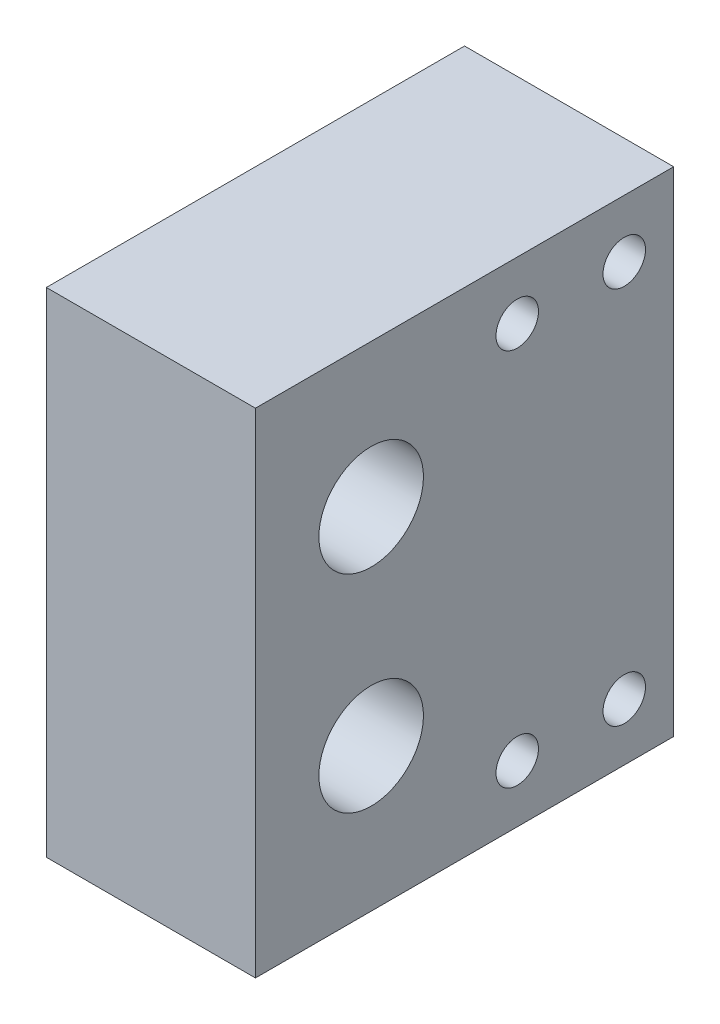
ISO-10303-21;
HEADER;
FILE_DESCRIPTION(('STEP AP214'),'2;1');
FILE_NAME('part.step','',(''),(''),'','','');
FILE_SCHEMA(('AUTOMOTIVE_DESIGN { 1 0 10303 214 1 1 1 1 }'));
ENDSEC;
DATA;
#1=APPLICATION_CONTEXT('core data for automotive mechanical design processes');
#2=APPLICATION_PROTOCOL_DEFINITION('international standard','automotive_design',2000,#1);
#3=PRODUCT_CONTEXT('',#1,'mechanical');
#4=PRODUCT('Part','Part','',(#3));
#5=PRODUCT_RELATED_PRODUCT_CATEGORY('part','',(#4));
#6=PRODUCT_DEFINITION_FORMATION('','',#4);
#7=PRODUCT_DEFINITION_CONTEXT('part definition',#1,'design');
#8=PRODUCT_DEFINITION('design','',#6,#7);
#9=PRODUCT_DEFINITION_SHAPE('','',#8);
#10=(LENGTH_UNIT() NAMED_UNIT(*) SI_UNIT(.MILLI.,.METRE.));
#11=(NAMED_UNIT(*) PLANE_ANGLE_UNIT() SI_UNIT($,.RADIAN.));
#12=(NAMED_UNIT(*) SI_UNIT($,.STERADIAN.) SOLID_ANGLE_UNIT());
#13=UNCERTAINTY_MEASURE_WITH_UNIT(LENGTH_MEASURE(1.E-05),#10,'distance_accuracy_value','');
#14=(GEOMETRIC_REPRESENTATION_CONTEXT(3) GLOBAL_UNCERTAINTY_ASSIGNED_CONTEXT((#13)) GLOBAL_UNIT_ASSIGNED_CONTEXT((#10,
#11,#12)) REPRESENTATION_CONTEXT('',''));
#15=CARTESIAN_POINT('',(0.,0.,0.));
#16=DIRECTION('',(0.,0.,1.));
#17=DIRECTION('',(1.,0.,0.));
#18=AXIS2_PLACEMENT_3D('',#15,#16,#17);
#19=CARTESIAN_POINT('',(-12.701,-12.573,36.7437942065578));
#20=DIRECTION('',(1.,0.,0.));
#21=DIRECTION('',(0.,1.,0.));
#22=AXIS2_PLACEMENT_3D('',#19,#20,#21);
#23=CYLINDRICAL_SURFACE('',#22,3.302);
#24=CARTESIAN_POINT('',(-12.7,-12.573,36.7437942065578));
#25=DIRECTION('',(1.,0.,0.));
#26=DIRECTION('',(0.,1.,0.));
#27=AXIS2_PLACEMENT_3D('',#24,#25,#26);
#28=CIRCLE('',#27,3.302);
#29=CARTESIAN_POINT('',(-12.7,-9.271,36.7437942065578));
#30=VERTEX_POINT('',#29);
#31=EDGE_CURVE('E111',#30,#30,#28,.F.);
#32=ORIENTED_EDGE('',*,*,#31,.T.);
#33=EDGE_LOOP('',(#32));
#34=FACE_BOUND('',#33,.T.);
#35=CARTESIAN_POINT('',(-6.35,-12.573,36.7437942065578));
#36=DIRECTION('',(1.,0.,0.));
#37=DIRECTION('',(0.,1.,0.));
#38=AXIS2_PLACEMENT_3D('',#35,#36,#37);
#39=CIRCLE('',#38,3.302);
#40=CARTESIAN_POINT('',(-6.35,-9.271,36.7437942065578));
#41=VERTEX_POINT('',#40);
#42=EDGE_CURVE('E38',#41,#41,#39,.F.);
#43=ORIENTED_EDGE('',*,*,#42,.F.);
#44=EDGE_LOOP('',(#43));
#45=FACE_BOUND('',#44,.T.);
#46=ADVANCED_FACE('F34',(#34,#45),#23,.F.);
#47=CARTESIAN_POINT('',(-12.701,12.573,36.7437942065578));
#48=DIRECTION('',(1.,0.,0.));
#49=DIRECTION('',(0.,1.,0.));
#50=AXIS2_PLACEMENT_3D('',#47,#48,#49);
#51=CYLINDRICAL_SURFACE('',#50,3.302);
#52=CARTESIAN_POINT('',(-12.7,12.573,36.7437942065578));
#53=DIRECTION('',(1.,0.,0.));
#54=DIRECTION('',(0.,1.,0.));
#55=AXIS2_PLACEMENT_3D('',#52,#53,#54);
#56=CIRCLE('',#55,3.302);
#57=CARTESIAN_POINT('',(-12.7,15.875,36.7437942065578));
#58=VERTEX_POINT('',#57);
#59=EDGE_CURVE('E116',#58,#58,#56,.F.);
#60=ORIENTED_EDGE('',*,*,#59,.T.);
#61=EDGE_LOOP('',(#60));
#62=FACE_BOUND('',#61,.T.);
#63=CARTESIAN_POINT('',(-6.35,12.573,36.7437942065578));
#64=DIRECTION('',(1.,0.,0.));
#65=DIRECTION('',(0.,1.,0.));
#66=AXIS2_PLACEMENT_3D('',#63,#64,#65);
#67=CIRCLE('',#66,3.302);
#68=CARTESIAN_POINT('',(-6.35,15.875,36.7437942065578));
#69=VERTEX_POINT('',#68);
#70=EDGE_CURVE('E109',#69,#69,#67,.F.);
#71=ORIENTED_EDGE('',*,*,#70,.F.);
#72=EDGE_LOOP('',(#71));
#73=FACE_BOUND('',#72,.T.);
#74=ADVANCED_FACE('F159',(#62,#73),#51,.F.);
#75=CARTESIAN_POINT('',(12.7,29.972,50.8));
#76=DIRECTION('',(-1.,0.,0.));
#77=DIRECTION('',(0.,-1.,0.));
#78=AXIS2_PLACEMENT_3D('',#75,#76,#77);
#79=PLANE('',#78);
#80=CARTESIAN_POINT('',(12.7,-12.573,36.7437942065578));
#81=DIRECTION('',(1.,0.,0.));
#82=DIRECTION('',(0.,1.,0.));
#83=AXIS2_PLACEMENT_3D('',#80,#81,#82);
#84=CIRCLE('',#83,6.35);
#85=CARTESIAN_POINT('',(12.7,-6.223,36.7437942065578));
#86=VERTEX_POINT('',#85);
#87=EDGE_CURVE('E126',#86,#86,#84,.T.);
#88=ORIENTED_EDGE('',*,*,#87,.F.);
#89=EDGE_LOOP('',(#88));
#90=FACE_BOUND('',#89,.T.);
#91=CARTESIAN_POINT('',(12.7,12.573,36.7437942065578));
#92=DIRECTION('',(1.,0.,0.));
#93=DIRECTION('',(0.,1.,0.));
#94=AXIS2_PLACEMENT_3D('',#91,#92,#93);
#95=CIRCLE('',#94,6.35);
#96=CARTESIAN_POINT('',(12.7,18.923,36.7437942065578));
#97=VERTEX_POINT('',#96);
#98=EDGE_CURVE('E119',#97,#97,#95,.T.);
#99=ORIENTED_EDGE('',*,*,#98,.F.);
#100=EDGE_LOOP('',(#99));
#101=FACE_BOUND('',#100,.T.);
#102=CARTESIAN_POINT('',(12.7,-23.0280000000008,6.00000000000013));
#103=DIRECTION('',(1.,0.,0.));
#104=DIRECTION('',(0.,1.,0.));
#105=AXIS2_PLACEMENT_3D('',#102,#103,#104);
#106=CIRCLE('',#105,2.5796875);
#107=CARTESIAN_POINT('',(12.7,-20.4483125000008,6.00000000000013));
#108=VERTEX_POINT('',#107);
#109=EDGE_CURVE('E131',#108,#108,#106,.T.);
#110=ORIENTED_EDGE('',*,*,#109,.F.);
#111=EDGE_LOOP('',(#110));
#112=FACE_BOUND('',#111,.T.);
#113=CARTESIAN_POINT('',(12.7,-23.0280000000008,19.0000000000001));
#114=DIRECTION('',(1.,0.,0.));
#115=DIRECTION('',(0.,1.,0.));
#116=AXIS2_PLACEMENT_3D('',#113,#114,#115);
#117=CIRCLE('',#116,2.5796875);
#118=CARTESIAN_POINT('',(12.7,-20.4483125000008,19.0000000000001));
#119=VERTEX_POINT('',#118);
#120=EDGE_CURVE('E135',#119,#119,#117,.T.);
#121=ORIENTED_EDGE('',*,*,#120,.F.);
#122=EDGE_LOOP('',(#121));
#123=FACE_BOUND('',#122,.T.);
#124=CARTESIAN_POINT('',(12.7,22.9719999999992,6.00000000000013));
#125=DIRECTION('',(1.,0.,0.));
#126=DIRECTION('',(0.,1.,0.));
#127=AXIS2_PLACEMENT_3D('',#124,#125,#126);
#128=CIRCLE('',#127,2.5796875);
#129=CARTESIAN_POINT('',(12.7,25.5516874999992,6.00000000000013));
#130=VERTEX_POINT('',#129);
#131=EDGE_CURVE('E141',#130,#130,#128,.T.);
#132=ORIENTED_EDGE('',*,*,#131,.F.);
#133=EDGE_LOOP('',(#132));
#134=FACE_BOUND('',#133,.T.);
#135=CARTESIAN_POINT('',(12.7,22.9719999999992,19.0000000000001));
#136=DIRECTION('',(1.,0.,0.));
#137=DIRECTION('',(0.,1.,0.));
#138=AXIS2_PLACEMENT_3D('',#135,#136,#137);
#139=CIRCLE('',#138,2.5796875);
#140=CARTESIAN_POINT('',(12.7,25.5516874999992,19.0000000000001));
#141=VERTEX_POINT('',#140);
#142=EDGE_CURVE('E147',#141,#141,#139,.T.);
#143=ORIENTED_EDGE('',*,*,#142,.F.);
#144=EDGE_LOOP('',(#143));
#145=FACE_BOUND('',#144,.T.);
#146=DIRECTION('',(0.,1.,0.));
#147=VECTOR('',#146,1.);
#148=CARTESIAN_POINT('',(12.7,29.972,0.));
#149=LINE('',#148,#147);
#150=CARTESIAN_POINT('',(12.7,-29.972,0.));
#151=VERTEX_POINT('',#150);
#152=CARTESIAN_POINT('',(12.7,29.972,0.));
#153=VERTEX_POINT('',#152);
#154=EDGE_CURVE('E101',#151,#153,#149,.T.);
#155=ORIENTED_EDGE('',*,*,#154,.T.);
#156=DIRECTION('',(0.,0.,-1.));
#157=VECTOR('',#156,1.);
#158=CARTESIAN_POINT('',(12.7,29.972,50.8));
#159=LINE('',#158,#157);
#160=CARTESIAN_POINT('',(12.7,29.972,50.8));
#161=VERTEX_POINT('',#160);
#162=EDGE_CURVE('E12',#161,#153,#159,.T.);
#163=ORIENTED_EDGE('',*,*,#162,.F.);
#164=DIRECTION('',(0.,1.,0.));
#165=VECTOR('',#164,1.);
#166=CARTESIAN_POINT('',(12.7,29.972,50.8));
#167=LINE('',#166,#165);
#168=CARTESIAN_POINT('',(12.7,-29.972,50.8));
#169=VERTEX_POINT('',#168);
#170=EDGE_CURVE('E88',#169,#161,#167,.T.);
#171=ORIENTED_EDGE('',*,*,#170,.F.);
#172=DIRECTION('',(0.,0.,-1.));
#173=VECTOR('',#172,1.);
#174=CARTESIAN_POINT('',(12.7,-29.972,50.8));
#175=LINE('',#174,#173);
#176=EDGE_CURVE('E97',#169,#151,#175,.T.);
#177=ORIENTED_EDGE('',*,*,#176,.T.);
#178=EDGE_LOOP('',(#155,#163,#171,#177));
#179=FACE_BOUND('',#178,.T.);
#180=ADVANCED_FACE('F36',(#90,#101,#112,#123,#134,#145,#179),#79,.F.);
#181=CARTESIAN_POINT('',(-12.7,29.972,50.8));
#182=DIRECTION('',(0.,-1.,0.));
#183=DIRECTION('',(0.,0.,-1.));
#184=AXIS2_PLACEMENT_3D('',#181,#182,#183);
#185=PLANE('',#184);
#186=DIRECTION('',(-1.,0.,0.));
#187=VECTOR('',#186,1.);
#188=CARTESIAN_POINT('',(-12.7,29.972,0.));
#189=LINE('',#188,#187);
#190=CARTESIAN_POINT('',(-12.7,29.972,0.));
#191=VERTEX_POINT('',#190);
#192=EDGE_CURVE('E92',#153,#191,#189,.T.);
#193=ORIENTED_EDGE('',*,*,#192,.T.);
#194=DIRECTION('',(0.,0.,-1.));
#195=VECTOR('',#194,1.);
#196=CARTESIAN_POINT('',(-12.7,29.972,50.8));
#197=LINE('',#196,#195);
#198=CARTESIAN_POINT('',(-12.7,29.972,50.8));
#199=VERTEX_POINT('',#198);
#200=EDGE_CURVE('E44',#199,#191,#197,.T.);
#201=ORIENTED_EDGE('',*,*,#200,.F.);
#202=DIRECTION('',(-1.,0.,0.));
#203=VECTOR('',#202,1.);
#204=CARTESIAN_POINT('',(-12.7,29.972,50.8));
#205=LINE('',#204,#203);
#206=EDGE_CURVE('E83',#161,#199,#205,.T.);
#207=ORIENTED_EDGE('',*,*,#206,.F.);
#208=ORIENTED_EDGE('',*,*,#162,.T.);
#209=EDGE_LOOP('',(#193,#201,#207,#208));
#210=FACE_BOUND('',#209,.T.);
#211=ADVANCED_FACE('F91',(#210),#185,.F.);
#212=CARTESIAN_POINT('',(-12.7,29.972,50.8));
#213=DIRECTION('',(1.,0.,0.));
#214=DIRECTION('',(0.,1.,0.));
#215=AXIS2_PLACEMENT_3D('',#212,#213,#214);
#216=PLANE('',#215);
#217=ORIENTED_EDGE('',*,*,#31,.F.);
#218=EDGE_LOOP('',(#217));
#219=FACE_BOUND('',#218,.T.);
#220=ORIENTED_EDGE('',*,*,#59,.F.);
#221=EDGE_LOOP('',(#220));
#222=FACE_BOUND('',#221,.T.);
#223=DIRECTION('',(0.,-1.,0.));
#224=VECTOR('',#223,1.);
#225=CARTESIAN_POINT('',(-12.7,29.972,0.));
#226=LINE('',#225,#224);
#227=CARTESIAN_POINT('',(-12.7,-29.972,0.));
#228=VERTEX_POINT('',#227);
#229=EDGE_CURVE('E70',#191,#228,#226,.T.);
#230=ORIENTED_EDGE('',*,*,#229,.T.);
#231=DIRECTION('',(0.,0.,-1.));
#232=VECTOR('',#231,1.);
#233=CARTESIAN_POINT('',(-12.7,-29.972,50.8));
#234=LINE('',#233,#232);
#235=CARTESIAN_POINT('',(-12.7,-29.972,50.8));
#236=VERTEX_POINT('',#235);
#237=EDGE_CURVE('E93',#236,#228,#234,.T.);
#238=ORIENTED_EDGE('',*,*,#237,.F.);
#239=DIRECTION('',(0.,-1.,0.));
#240=VECTOR('',#239,1.);
#241=CARTESIAN_POINT('',(-12.7,29.972,50.8));
#242=LINE('',#241,#240);
#243=EDGE_CURVE('E86',#199,#236,#242,.T.);
#244=ORIENTED_EDGE('',*,*,#243,.F.);
#245=ORIENTED_EDGE('',*,*,#200,.T.);
#246=EDGE_LOOP('',(#230,#238,#244,#245));
#247=FACE_BOUND('',#246,.T.);
#248=ADVANCED_FACE('F95',(#219,#222,#247),#216,.F.);
#249=CARTESIAN_POINT('',(-12.7,-29.972,50.8));
#250=DIRECTION('',(0.,1.,0.));
#251=DIRECTION('',(0.,0.,1.));
#252=AXIS2_PLACEMENT_3D('',#249,#250,#251);
#253=PLANE('',#252);
#254=ORIENTED_EDGE('',*,*,#176,.F.);
#255=DIRECTION('',(1.,0.,0.));
#256=VECTOR('',#255,1.);
#257=CARTESIAN_POINT('',(-12.7,-29.972,50.8));
#258=LINE('',#257,#256);
#259=EDGE_CURVE('E53',#236,#169,#258,.T.);
#260=ORIENTED_EDGE('',*,*,#259,.F.);
#261=ORIENTED_EDGE('',*,*,#237,.T.);
#262=DIRECTION('',(1.,0.,0.));
#263=VECTOR('',#262,1.);
#264=CARTESIAN_POINT('',(-12.7,-29.972,0.));
#265=LINE('',#264,#263);
#266=EDGE_CURVE('E76',#228,#151,#265,.T.);
#267=ORIENTED_EDGE('',*,*,#266,.T.);
#268=EDGE_LOOP('',(#254,#260,#261,#267));
#269=FACE_BOUND('',#268,.T.);
#270=ADVANCED_FACE('F173',(#269),#253,.F.);
#271=CARTESIAN_POINT('',(0.,0.,50.8));
#272=DIRECTION('',(0.,0.,1.));
#273=DIRECTION('',(1.,0.,0.));
#274=AXIS2_PLACEMENT_3D('',#271,#272,#273);
#275=PLANE('',#274);
#276=ORIENTED_EDGE('',*,*,#206,.T.);
#277=ORIENTED_EDGE('',*,*,#243,.T.);
#278=ORIENTED_EDGE('',*,*,#259,.T.);
#279=ORIENTED_EDGE('',*,*,#170,.T.);
#280=EDGE_LOOP('',(#276,#277,#278,#279));
#281=FACE_BOUND('',#280,.T.);
#282=ADVANCED_FACE('F84',(#281),#275,.T.);
#283=CARTESIAN_POINT('',(0.,0.,0.));
#284=DIRECTION('',(0.,0.,1.));
#285=DIRECTION('',(1.,0.,0.));
#286=AXIS2_PLACEMENT_3D('',#283,#284,#285);
#287=PLANE('',#286);
#288=ORIENTED_EDGE('',*,*,#154,.F.);
#289=ORIENTED_EDGE('',*,*,#266,.F.);
#290=ORIENTED_EDGE('',*,*,#229,.F.);
#291=ORIENTED_EDGE('',*,*,#192,.F.);
#292=EDGE_LOOP('',(#288,#289,#290,#291));
#293=FACE_BOUND('',#292,.T.);
#294=ADVANCED_FACE('F163',(#293),#287,.F.);
#295=CARTESIAN_POINT('',(2.54,22.9719999999992,19.0000000000001));
#296=DIRECTION('',(1.,0.,0.));
#297=DIRECTION('',(0.,1.,0.));
#298=AXIS2_PLACEMENT_3D('',#295,#296,#297);
#299=CYLINDRICAL_SURFACE('',#298,2.5796875);
#300=CARTESIAN_POINT('',(2.54,22.9719999999992,19.0000000000001));
#301=DIRECTION('',(1.,0.,0.));
#302=DIRECTION('',(0.,1.,0.));
#303=AXIS2_PLACEMENT_3D('',#300,#301,#302);
#304=CIRCLE('',#303,2.5796875);
#305=CARTESIAN_POINT('',(2.54,25.5516874999992,19.0000000000001));
#306=VERTEX_POINT('',#305);
#307=EDGE_CURVE('E104',#306,#306,#304,.T.);
#308=ORIENTED_EDGE('',*,*,#307,.F.);
#309=EDGE_LOOP('',(#308));
#310=FACE_BOUND('',#309,.T.);
#311=ORIENTED_EDGE('',*,*,#142,.T.);
#312=EDGE_LOOP('',(#311));
#313=FACE_BOUND('',#312,.T.);
#314=ADVANCED_FACE('F155',(#310,#313),#299,.F.);
#315=CARTESIAN_POINT('',(2.54,22.9719999999992,19.0000000000001));
#316=DIRECTION('',(1.,0.,0.));
#317=DIRECTION('',(0.,1.,0.));
#318=AXIS2_PLACEMENT_3D('',#315,#316,#317);
#319=PLANE('',#318);
#320=ORIENTED_EDGE('',*,*,#307,.T.);
#321=EDGE_LOOP('',(#320));
#322=FACE_BOUND('',#321,.T.);
#323=ADVANCED_FACE('F170',(#322),#319,.T.);
#324=CARTESIAN_POINT('',(2.54,22.9719999999992,6.00000000000013));
#325=DIRECTION('',(1.,0.,0.));
#326=DIRECTION('',(0.,1.,0.));
#327=AXIS2_PLACEMENT_3D('',#324,#325,#326);
#328=CYLINDRICAL_SURFACE('',#327,2.5796875);
#329=CARTESIAN_POINT('',(2.54,22.9719999999992,6.00000000000013));
#330=DIRECTION('',(1.,0.,0.));
#331=DIRECTION('',(0.,1.,0.));
#332=AXIS2_PLACEMENT_3D('',#329,#330,#331);
#333=CIRCLE('',#332,2.5796875);
#334=CARTESIAN_POINT('',(2.54,25.5516874999992,6.00000000000013));
#335=VERTEX_POINT('',#334);
#336=EDGE_CURVE('E144',#335,#335,#333,.T.);
#337=ORIENTED_EDGE('',*,*,#336,.F.);
#338=EDGE_LOOP('',(#337));
#339=FACE_BOUND('',#338,.T.);
#340=ORIENTED_EDGE('',*,*,#131,.T.);
#341=EDGE_LOOP('',(#340));
#342=FACE_BOUND('',#341,.T.);
#343=ADVANCED_FACE('F209',(#339,#342),#328,.F.);
#344=CARTESIAN_POINT('',(2.54,22.9719999999992,6.00000000000013));
#345=DIRECTION('',(1.,0.,0.));
#346=DIRECTION('',(0.,1.,0.));
#347=AXIS2_PLACEMENT_3D('',#344,#345,#346);
#348=PLANE('',#347);
#349=ORIENTED_EDGE('',*,*,#336,.T.);
#350=EDGE_LOOP('',(#349));
#351=FACE_BOUND('',#350,.T.);
#352=ADVANCED_FACE('F205',(#351),#348,.T.);
#353=CARTESIAN_POINT('',(2.54,-23.0280000000008,19.0000000000001));
#354=DIRECTION('',(1.,0.,0.));
#355=DIRECTION('',(0.,1.,0.));
#356=AXIS2_PLACEMENT_3D('',#353,#354,#355);
#357=CYLINDRICAL_SURFACE('',#356,2.5796875);
#358=CARTESIAN_POINT('',(2.54,-23.0280000000008,19.0000000000001));
#359=DIRECTION('',(1.,0.,0.));
#360=DIRECTION('',(0.,1.,0.));
#361=AXIS2_PLACEMENT_3D('',#358,#359,#360);
#362=CIRCLE('',#361,2.5796875);
#363=CARTESIAN_POINT('',(2.54,-20.4483125000008,19.0000000000001));
#364=VERTEX_POINT('',#363);
#365=EDGE_CURVE('E138',#364,#364,#362,.T.);
#366=ORIENTED_EDGE('',*,*,#365,.F.);
#367=EDGE_LOOP('',(#366));
#368=FACE_BOUND('',#367,.T.);
#369=ORIENTED_EDGE('',*,*,#120,.T.);
#370=EDGE_LOOP('',(#369));
#371=FACE_BOUND('',#370,.T.);
#372=ADVANCED_FACE('F201',(#368,#371),#357,.F.);
#373=CARTESIAN_POINT('',(2.54,-23.0280000000008,19.0000000000001));
#374=DIRECTION('',(1.,0.,0.));
#375=DIRECTION('',(0.,1.,0.));
#376=AXIS2_PLACEMENT_3D('',#373,#374,#375);
#377=PLANE('',#376);
#378=ORIENTED_EDGE('',*,*,#365,.T.);
#379=EDGE_LOOP('',(#378));
#380=FACE_BOUND('',#379,.T.);
#381=ADVANCED_FACE('F197',(#380),#377,.T.);
#382=CARTESIAN_POINT('',(2.54,-23.0280000000008,6.00000000000013));
#383=DIRECTION('',(1.,0.,0.));
#384=DIRECTION('',(0.,1.,0.));
#385=AXIS2_PLACEMENT_3D('',#382,#383,#384);
#386=CYLINDRICAL_SURFACE('',#385,2.5796875);
#387=CARTESIAN_POINT('',(2.54,-23.0280000000008,6.00000000000013));
#388=DIRECTION('',(1.,0.,0.));
#389=DIRECTION('',(0.,1.,0.));
#390=AXIS2_PLACEMENT_3D('',#387,#388,#389);
#391=CIRCLE('',#390,2.5796875);
#392=CARTESIAN_POINT('',(2.54,-20.4483125000008,6.00000000000013));
#393=VERTEX_POINT('',#392);
#394=EDGE_CURVE('E132',#393,#393,#391,.T.);
#395=ORIENTED_EDGE('',*,*,#394,.F.);
#396=EDGE_LOOP('',(#395));
#397=FACE_BOUND('',#396,.T.);
#398=ORIENTED_EDGE('',*,*,#109,.T.);
#399=EDGE_LOOP('',(#398));
#400=FACE_BOUND('',#399,.T.);
#401=ADVANCED_FACE('F193',(#397,#400),#386,.F.);
#402=CARTESIAN_POINT('',(2.54,-23.0280000000008,6.00000000000013));
#403=DIRECTION('',(1.,0.,0.));
#404=DIRECTION('',(0.,1.,0.));
#405=AXIS2_PLACEMENT_3D('',#402,#403,#404);
#406=PLANE('',#405);
#407=ORIENTED_EDGE('',*,*,#394,.T.);
#408=EDGE_LOOP('',(#407));
#409=FACE_BOUND('',#408,.T.);
#410=ADVANCED_FACE('F190',(#409),#406,.T.);
#411=CARTESIAN_POINT('',(-6.35,12.573,36.7437942065578));
#412=DIRECTION('',(1.,0.,0.));
#413=DIRECTION('',(0.,1.,0.));
#414=AXIS2_PLACEMENT_3D('',#411,#412,#413);
#415=PLANE('',#414);
#416=CARTESIAN_POINT('',(-6.35,12.573,36.7437942065578));
#417=DIRECTION('',(1.,0.,0.));
#418=DIRECTION('',(0.,1.,0.));
#419=AXIS2_PLACEMENT_3D('',#416,#417,#418);
#420=CIRCLE('',#419,6.35);
#421=CARTESIAN_POINT('',(-6.35,18.923,36.7437942065578));
#422=VERTEX_POINT('',#421);
#423=EDGE_CURVE('E112',#422,#422,#420,.T.);
#424=ORIENTED_EDGE('',*,*,#423,.T.);
#425=EDGE_LOOP('',(#424));
#426=FACE_BOUND('',#425,.T.);
#427=ORIENTED_EDGE('',*,*,#70,.T.);
#428=EDGE_LOOP('',(#427));
#429=FACE_BOUND('',#428,.T.);
#430=ADVANCED_FACE('F192',(#426,#429),#415,.T.);
#431=CARTESIAN_POINT('',(-6.35,12.573,36.7437942065578));
#432=DIRECTION('',(1.,0.,0.));
#433=DIRECTION('',(0.,1.,0.));
#434=AXIS2_PLACEMENT_3D('',#431,#432,#433);
#435=CYLINDRICAL_SURFACE('',#434,6.35);
#436=CARTESIAN_POINT('',(-6.35,18.923,36.7437942065578));
#437=CARTESIAN_POINT('',(-6.1515625,18.923,36.7437942065578));
#438=CARTESIAN_POINT('',(-5.953125,18.923,36.7437942065578));
#439=CARTESIAN_POINT('',(-5.55625,18.923,36.7437942065578));
#440=CARTESIAN_POINT('',(-5.3578125,18.923,36.7437942065578));
#441=CARTESIAN_POINT('',(-4.9609375,18.923,36.7437942065578));
#442=CARTESIAN_POINT('',(-4.7625,18.923,36.7437942065578));
#443=CARTESIAN_POINT('',(-4.365625,18.923,36.7437942065578));
#444=CARTESIAN_POINT('',(-4.1671875,18.923,36.7437942065578));
#445=CARTESIAN_POINT('',(-3.7703125,18.923,36.7437942065578));
#446=CARTESIAN_POINT('',(-3.571875,18.923,36.7437942065578));
#447=CARTESIAN_POINT('',(-3.175,18.923,36.7437942065578));
#448=CARTESIAN_POINT('',(-2.9765625,18.923,36.7437942065578));
#449=CARTESIAN_POINT('',(-2.5796875,18.923,36.7437942065578));
#450=CARTESIAN_POINT('',(-2.38125,18.923,36.7437942065578));
#451=CARTESIAN_POINT('',(-1.984375,18.923,36.7437942065578));
#452=CARTESIAN_POINT('',(-1.7859375,18.923,36.7437942065578));
#453=CARTESIAN_POINT('',(-1.3890625,18.923,36.7437942065578));
#454=CARTESIAN_POINT('',(-1.190625,18.923,36.7437942065578));
#455=CARTESIAN_POINT('',(-0.793750000000002,18.923,36.7437942065578));
#456=CARTESIAN_POINT('',(-0.595312500000002,18.923,36.7437942065578));
#457=CARTESIAN_POINT('',(-0.198437500000002,18.923,36.7437942065578));
#458=CARTESIAN_POINT('',(0.,18.923,36.7437942065578));
#459=CARTESIAN_POINT('',(0.396874999999998,18.923,36.7437942065578));
#460=CARTESIAN_POINT('',(0.595312499999998,18.923,36.7437942065578));
#461=CARTESIAN_POINT('',(0.992187499999998,18.923,36.7437942065578));
#462=CARTESIAN_POINT('',(1.190625,18.923,36.7437942065578));
#463=CARTESIAN_POINT('',(1.5875,18.923,36.7437942065578));
#464=CARTESIAN_POINT('',(1.7859375,18.923,36.7437942065578));
#465=CARTESIAN_POINT('',(2.1828125,18.923,36.7437942065578));
#466=CARTESIAN_POINT('',(2.38125,18.923,36.7437942065578));
#467=CARTESIAN_POINT('',(2.778125,18.923,36.7437942065578));
#468=CARTESIAN_POINT('',(2.9765625,18.923,36.7437942065578));
#469=CARTESIAN_POINT('',(3.3734375,18.923,36.7437942065578));
#470=CARTESIAN_POINT('',(3.571875,18.923,36.7437942065578));
#471=CARTESIAN_POINT('',(3.96875,18.923,36.7437942065578));
#472=CARTESIAN_POINT('',(4.1671875,18.923,36.7437942065578));
#473=CARTESIAN_POINT('',(4.5640625,18.923,36.7437942065578));
#474=CARTESIAN_POINT('',(4.7625,18.923,36.7437942065578));
#475=CARTESIAN_POINT('',(5.159375,18.923,36.7437942065578));
#476=CARTESIAN_POINT('',(5.3578125,18.923,36.7437942065578));
#477=CARTESIAN_POINT('',(5.7546875,18.923,36.7437942065578));
#478=CARTESIAN_POINT('',(5.953125,18.923,36.7437942065578));
#479=CARTESIAN_POINT('',(6.35,18.923,36.7437942065578));
#480=CARTESIAN_POINT('',(6.5484375,18.923,36.7437942065578));
#481=CARTESIAN_POINT('',(6.9453125,18.923,36.7437942065578));
#482=CARTESIAN_POINT('',(7.14375,18.923,36.7437942065578));
#483=CARTESIAN_POINT('',(7.540625,18.923,36.7437942065578));
#484=CARTESIAN_POINT('',(7.7390625,18.923,36.7437942065578));
#485=CARTESIAN_POINT('',(8.1359375,18.923,36.7437942065578));
#486=CARTESIAN_POINT('',(8.334375,18.923,36.7437942065578));
#487=CARTESIAN_POINT('',(8.73125,18.923,36.7437942065578));
#488=CARTESIAN_POINT('',(8.9296875,18.923,36.7437942065578));
#489=CARTESIAN_POINT('',(9.3265625,18.923,36.7437942065578));
#490=CARTESIAN_POINT('',(9.525,18.923,36.7437942065578));
#491=CARTESIAN_POINT('',(9.921875,18.923,36.7437942065578));
#492=CARTESIAN_POINT('',(10.1203125,18.923,36.7437942065578));
#493=CARTESIAN_POINT('',(10.5171875,18.923,36.7437942065578));
#494=CARTESIAN_POINT('',(10.715625,18.923,36.7437942065578));
#495=CARTESIAN_POINT('',(11.1125,18.923,36.7437942065578));
#496=CARTESIAN_POINT('',(11.3109375,18.923,36.7437942065578));
#497=CARTESIAN_POINT('',(11.7078125,18.923,36.7437942065578));
#498=CARTESIAN_POINT('',(11.90625,18.923,36.7437942065578));
#499=CARTESIAN_POINT('',(12.303125,18.923,36.7437942065578));
#500=CARTESIAN_POINT('',(12.5015625,18.923,36.7437942065578));
#501=CARTESIAN_POINT('',(12.7,18.923,36.7437942065578));
#502=B_SPLINE_CURVE_WITH_KNOTS('',3,(#436,#437,#438,#439,#440,#441,#442,#443,#444,#445,#446,
#447,#448,#449,#450,#451,#452,#453,#454,#455,#456,#457,#458,#459,#460,#461,#462,#463,#464,#465,
#466,#467,#468,#469,#470,#471,#472,#473,#474,#475,#476,#477,#478,#479,#480,#481,#482,#483,#484,
#485,#486,#487,#488,#489,#490,#491,#492,#493,#494,#495,#496,#497,#498,#499,#500,#501),
.UNSPECIFIED.,.F.,.F.,(4,2,2,2,2,2,2,2,2,2,2,2,2,2,2,2,2,2,2,2,2,2,2,2,2,2,2,2,2,2,2,2,4),(0.,
0.5953125,1.190625,1.7859375,2.38125,2.9765625,3.571875,4.1671875,4.7625,5.3578125,5.953125,
6.5484375,7.14375,7.7390625,8.334375,8.9296875,9.525,10.1203125,10.715625,11.3109375,11.90625,
12.5015625,13.096875,13.6921875,14.2875,14.8828125,15.478125,16.0734375,16.66875,17.2640625,
17.859375,18.4546875,19.05),.UNSPECIFIED.);
#503=EDGE_CURVE('BSEAM187',#422,#97,#502,.T.);
#504=ORIENTED_EDGE('',*,*,#423,.F.);
#505=ORIENTED_EDGE('',*,*,#98,.T.);
#506=ORIENTED_EDGE('',*,*,#503,.T.);
#507=ORIENTED_EDGE('',*,*,#503,.F.);
#508=EDGE_LOOP('',(#504,#506,#505,#507));
#509=FACE_BOUND('',#508,.T.);
#510=ADVANCED_FACE('F187',(#509),#435,.F.);
#511=CARTESIAN_POINT('',(-6.35,-12.573,36.7437942065578));
#512=DIRECTION('',(1.,0.,0.));
#513=DIRECTION('',(0.,1.,0.));
#514=AXIS2_PLACEMENT_3D('',#511,#512,#513);
#515=PLANE('',#514);
#516=CARTESIAN_POINT('',(-6.35,-12.573,36.7437942065578));
#517=DIRECTION('',(1.,0.,0.));
#518=DIRECTION('',(0.,1.,0.));
#519=AXIS2_PLACEMENT_3D('',#516,#517,#518);
#520=CIRCLE('',#519,6.35);
#521=CARTESIAN_POINT('',(-6.35,-6.22300000000001,36.7437942065578));
#522=VERTEX_POINT('',#521);
#523=EDGE_CURVE('E310',#522,#522,#520,.T.);
#524=ORIENTED_EDGE('',*,*,#523,.T.);
#525=EDGE_LOOP('',(#524));
#526=FACE_BOUND('',#525,.T.);
#527=ORIENTED_EDGE('',*,*,#42,.T.);
#528=EDGE_LOOP('',(#527));
#529=FACE_BOUND('',#528,.T.);
#530=ADVANCED_FACE('F284',(#526,#529),#515,.T.);
#531=CARTESIAN_POINT('',(-6.35,-12.573,36.7437942065578));
#532=DIRECTION('',(1.,0.,0.));
#533=DIRECTION('',(0.,1.,0.));
#534=AXIS2_PLACEMENT_3D('',#531,#532,#533);
#535=CYLINDRICAL_SURFACE('',#534,6.35);
#536=CARTESIAN_POINT('',(-6.35,-6.22300000000001,36.7437942065578));
#537=CARTESIAN_POINT('',(-6.1515625,-6.22300000000001,36.7437942065578));
#538=CARTESIAN_POINT('',(-5.953125,-6.22300000000001,36.7437942065578));
#539=CARTESIAN_POINT('',(-5.55625,-6.22300000000001,36.7437942065578));
#540=CARTESIAN_POINT('',(-5.3578125,-6.22300000000001,36.7437942065578));
#541=CARTESIAN_POINT('',(-4.9609375,-6.22300000000001,36.7437942065578));
#542=CARTESIAN_POINT('',(-4.7625,-6.22300000000001,36.7437942065578));
#543=CARTESIAN_POINT('',(-4.365625,-6.22300000000001,36.7437942065578));
#544=CARTESIAN_POINT('',(-4.1671875,-6.22300000000001,36.7437942065578));
#545=CARTESIAN_POINT('',(-3.7703125,-6.22300000000001,36.7437942065578));
#546=CARTESIAN_POINT('',(-3.571875,-6.22300000000001,36.7437942065578));
#547=CARTESIAN_POINT('',(-3.175,-6.22300000000001,36.7437942065578));
#548=CARTESIAN_POINT('',(-2.9765625,-6.22300000000001,36.7437942065578));
#549=CARTESIAN_POINT('',(-2.5796875,-6.22300000000001,36.7437942065578));
#550=CARTESIAN_POINT('',(-2.38125,-6.223,36.7437942065578));
#551=CARTESIAN_POINT('',(-1.984375,-6.223,36.7437942065578));
#552=CARTESIAN_POINT('',(-1.7859375,-6.223,36.7437942065578));
#553=CARTESIAN_POINT('',(-1.3890625,-6.223,36.7437942065578));
#554=CARTESIAN_POINT('',(-1.190625,-6.223,36.7437942065578));
#555=CARTESIAN_POINT('',(-0.793749999999998,-6.223,36.7437942065578));
#556=CARTESIAN_POINT('',(-0.595312499999998,-6.223,36.7437942065578));
#557=CARTESIAN_POINT('',(-0.198437499999998,-6.223,36.7437942065578));
#558=CARTESIAN_POINT('',(0.,-6.223,36.7437942065578));
#559=CARTESIAN_POINT('',(0.396875000000002,-6.223,36.7437942065578));
#560=CARTESIAN_POINT('',(0.595312500000002,-6.223,36.7437942065578));
#561=CARTESIAN_POINT('',(0.992187500000002,-6.223,36.7437942065578));
#562=CARTESIAN_POINT('',(1.190625,-6.223,36.7437942065578));
#563=CARTESIAN_POINT('',(1.5875,-6.223,36.7437942065578));
#564=CARTESIAN_POINT('',(1.7859375,-6.223,36.7437942065578));
#565=CARTESIAN_POINT('',(2.1828125,-6.223,36.7437942065578));
#566=CARTESIAN_POINT('',(2.38125,-6.223,36.7437942065578));
#567=CARTESIAN_POINT('',(2.778125,-6.223,36.7437942065578));
#568=CARTESIAN_POINT('',(2.9765625,-6.223,36.7437942065578));
#569=CARTESIAN_POINT('',(3.3734375,-6.223,36.7437942065578));
#570=CARTESIAN_POINT('',(3.571875,-6.223,36.7437942065578));
#571=CARTESIAN_POINT('',(3.96875,-6.223,36.7437942065578));
#572=CARTESIAN_POINT('',(4.1671875,-6.223,36.7437942065578));
#573=CARTESIAN_POINT('',(4.5640625,-6.223,36.7437942065578));
#574=CARTESIAN_POINT('',(4.7625,-6.223,36.7437942065578));
#575=CARTESIAN_POINT('',(5.159375,-6.223,36.7437942065578));
#576=CARTESIAN_POINT('',(5.3578125,-6.223,36.7437942065578));
#577=CARTESIAN_POINT('',(5.7546875,-6.223,36.7437942065578));
#578=CARTESIAN_POINT('',(5.953125,-6.223,36.7437942065578));
#579=CARTESIAN_POINT('',(6.35,-6.223,36.7437942065578));
#580=CARTESIAN_POINT('',(6.5484375,-6.223,36.7437942065578));
#581=CARTESIAN_POINT('',(6.9453125,-6.223,36.7437942065578));
#582=CARTESIAN_POINT('',(7.14375,-6.223,36.7437942065578));
#583=CARTESIAN_POINT('',(7.540625,-6.223,36.7437942065578));
#584=CARTESIAN_POINT('',(7.7390625,-6.223,36.7437942065578));
#585=CARTESIAN_POINT('',(8.1359375,-6.223,36.7437942065578));
#586=CARTESIAN_POINT('',(8.334375,-6.223,36.7437942065578));
#587=CARTESIAN_POINT('',(8.73125,-6.223,36.7437942065578));
#588=CARTESIAN_POINT('',(8.9296875,-6.223,36.7437942065578));
#589=CARTESIAN_POINT('',(9.3265625,-6.223,36.7437942065578));
#590=CARTESIAN_POINT('',(9.525,-6.223,36.7437942065578));
#591=CARTESIAN_POINT('',(9.921875,-6.223,36.7437942065578));
#592=CARTESIAN_POINT('',(10.1203125,-6.223,36.7437942065578));
#593=CARTESIAN_POINT('',(10.5171875,-6.223,36.7437942065578));
#594=CARTESIAN_POINT('',(10.715625,-6.223,36.7437942065578));
#595=CARTESIAN_POINT('',(11.1125,-6.223,36.7437942065578));
#596=CARTESIAN_POINT('',(11.3109375,-6.223,36.7437942065578));
#597=CARTESIAN_POINT('',(11.7078125,-6.223,36.7437942065578));
#598=CARTESIAN_POINT('',(11.90625,-6.223,36.7437942065578));
#599=CARTESIAN_POINT('',(12.303125,-6.223,36.7437942065578));
#600=CARTESIAN_POINT('',(12.5015625,-6.223,36.7437942065578));
#601=CARTESIAN_POINT('',(12.7,-6.223,36.7437942065578));
#602=B_SPLINE_CURVE_WITH_KNOTS('',3,(#536,#537,#538,#539,#540,#541,#542,#543,#544,#545,#546,
#547,#548,#549,#550,#551,#552,#553,#554,#555,#556,#557,#558,#559,#560,#561,#562,#563,#564,#565,
#566,#567,#568,#569,#570,#571,#572,#573,#574,#575,#576,#577,#578,#579,#580,#581,#582,#583,#584,
#585,#586,#587,#588,#589,#590,#591,#592,#593,#594,#595,#596,#597,#598,#599,#600,#601),
.UNSPECIFIED.,.F.,.F.,(4,2,2,2,2,2,2,2,2,2,2,2,2,2,2,2,2,2,2,2,2,2,2,2,2,2,2,2,2,2,2,2,4),(0.,
0.5953125,1.190625,1.7859375,2.38125,2.9765625,3.571875,4.1671875,4.7625,5.3578125,5.953125,
6.5484375,7.14375,7.7390625,8.334375,8.9296875,9.525,10.1203125,10.715625,11.3109375,11.90625,
12.5015625,13.096875,13.6921875,14.2875,14.8828125,15.478125,16.0734375,16.66875,17.2640625,
17.859375,18.4546875,19.05),.UNSPECIFIED.);
#603=EDGE_CURVE('BSEAM293',#522,#86,#602,.T.);
#604=ORIENTED_EDGE('',*,*,#523,.F.);
#605=ORIENTED_EDGE('',*,*,#87,.T.);
#606=ORIENTED_EDGE('',*,*,#603,.T.);
#607=ORIENTED_EDGE('',*,*,#603,.F.);
#608=EDGE_LOOP('',(#604,#606,#605,#607));
#609=FACE_BOUND('',#608,.T.);
#610=ADVANCED_FACE('F293',(#609),#535,.F.);
#611=CLOSED_SHELL('',(#46,#74,#180,#211,#248,#270,#282,#294,#314,#323,#343,#352,#372,#381,#401,
#410,#430,#510,#530,#610));
#612=MANIFOLD_SOLID_BREP('B2',#611);
#613=ADVANCED_BREP_SHAPE_REPRESENTATION('',(#18,#612),#14);
#614=SHAPE_DEFINITION_REPRESENTATION(#9,#613);
ENDSEC;
END-ISO-10303-21;
